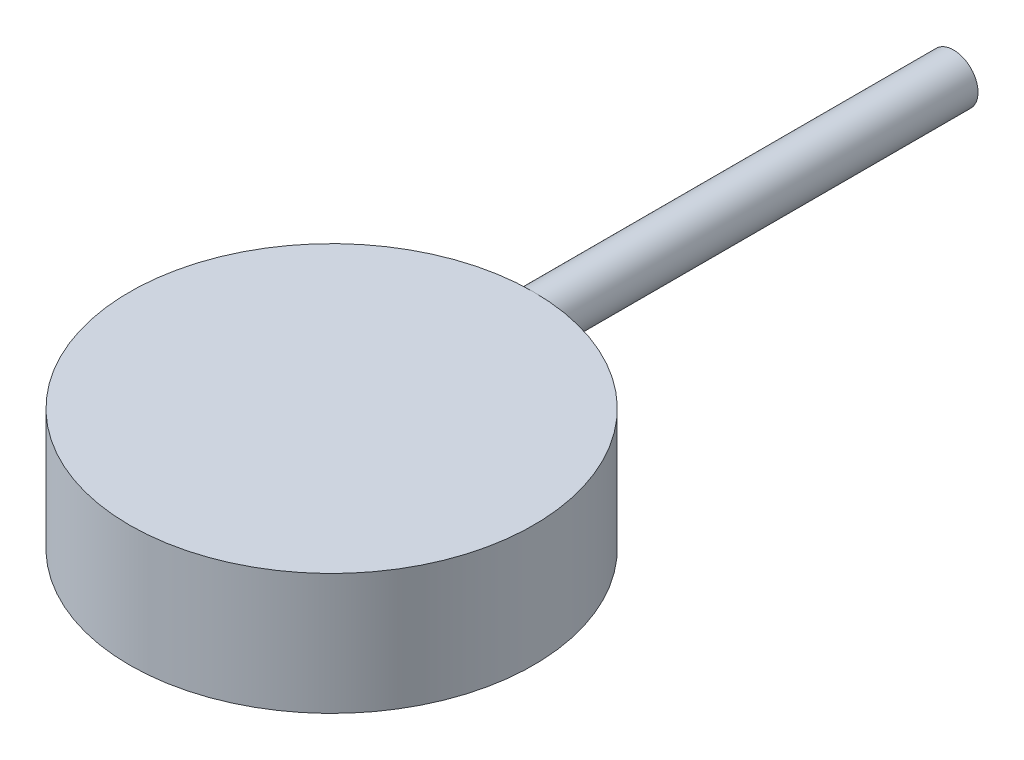
ISO-10303-21;
HEADER;
FILE_DESCRIPTION(('STEP AP214'),'2;1');
FILE_NAME('part.step','',(''),(''),'','','');
FILE_SCHEMA(('AUTOMOTIVE_DESIGN { 1 0 10303 214 1 1 1 1 }'));
ENDSEC;
DATA;
#1=APPLICATION_CONTEXT('core data for automotive mechanical design processes');
#2=APPLICATION_PROTOCOL_DEFINITION('international standard','automotive_design',2000,#1);
#3=PRODUCT_CONTEXT('',#1,'mechanical');
#4=PRODUCT('Part','Part','',(#3));
#5=PRODUCT_RELATED_PRODUCT_CATEGORY('part','',(#4));
#6=PRODUCT_DEFINITION_FORMATION('','',#4);
#7=PRODUCT_DEFINITION_CONTEXT('part definition',#1,'design');
#8=PRODUCT_DEFINITION('design','',#6,#7);
#9=PRODUCT_DEFINITION_SHAPE('','',#8);
#10=(LENGTH_UNIT() NAMED_UNIT(*) SI_UNIT(.MILLI.,.METRE.));
#11=(NAMED_UNIT(*) PLANE_ANGLE_UNIT() SI_UNIT($,.RADIAN.));
#12=(NAMED_UNIT(*) SI_UNIT($,.STERADIAN.) SOLID_ANGLE_UNIT());
#13=UNCERTAINTY_MEASURE_WITH_UNIT(LENGTH_MEASURE(1.E-05),#10,'distance_accuracy_value','');
#14=(GEOMETRIC_REPRESENTATION_CONTEXT(3) GLOBAL_UNCERTAINTY_ASSIGNED_CONTEXT((#13)) GLOBAL_UNIT_ASSIGNED_CONTEXT((#10,
#11,#12)) REPRESENTATION_CONTEXT('',''));
#15=CARTESIAN_POINT('',(0.,0.,0.));
#16=DIRECTION('',(0.,0.,1.));
#17=DIRECTION('',(1.,0.,0.));
#18=AXIS2_PLACEMENT_3D('',#15,#16,#17);
#19=CARTESIAN_POINT('',(0.,-19.67000003,0.));
#20=DIRECTION('',(0.,1.,0.));
#21=DIRECTION('',(0.,0.,1.));
#22=AXIS2_PLACEMENT_3D('',#19,#20,#21);
#23=CYLINDRICAL_SURFACE('',#22,41.25);
#24=CARTESIAN_POINT('',(-5.00000000000001,0.,-40.945848385398));
#25=CARTESIAN_POINT('',(-5.00000156734093,0.139920685005649,-40.9458478610933));
#26=CARTESIAN_POINT('',(-4.99412454109283,0.279818224188652,-40.9465670468577));
#27=CARTESIAN_POINT('',(-4.97066135474927,0.558657802768484,-40.9494221226675));
#28=CARTESIAN_POINT('',(-4.95307251442311,0.697599616093763,-40.9515583369974));
#29=CARTESIAN_POINT('',(-4.90629437802048,0.973592920854009,-40.9571889643499));
#30=CARTESIAN_POINT('',(-4.8770963362389,1.11064290636975,-40.960684401289));
#31=CARTESIAN_POINT('',(-4.80730369650415,1.38182494855259,-40.968934150293));
#32=CARTESIAN_POINT('',(-4.76670492390868,1.51595591693179,-40.9736889234567));
#33=CARTESIAN_POINT('',(-4.6744610876536,1.78016064082873,-40.9843148610967));
#34=CARTESIAN_POINT('',(-4.62282756619104,1.91023847421451,-40.9901848583569));
#35=CARTESIAN_POINT('',(-4.50884195814959,2.16561869954513,-41.0028795538187));
#36=CARTESIAN_POINT('',(-4.4464859238469,2.29091931182129,-41.0097046034705));
#37=CARTESIAN_POINT('',(-4.31155202035671,2.53575359750926,-41.0241102010539));
#38=CARTESIAN_POINT('',(-4.23897980596531,2.65529041245059,-41.0316903303643));
#39=CARTESIAN_POINT('',(-4.08407190488934,2.88788649445292,-41.0473984207842));
#40=CARTESIAN_POINT('',(-4.00173260472004,3.00094334106178,-41.0555265841643));
#41=CARTESIAN_POINT('',(-3.82751100040631,3.22022575632799,-41.0721358974309));
#42=CARTESIAN_POINT('',(-3.73558884076753,3.32641955680075,-41.0806184258526));
#43=CARTESIAN_POINT('',(-3.5431080050124,3.53073526353151,-41.0976668582032));
#44=CARTESIAN_POINT('',(-3.44254614759134,3.62885417019382,-41.1062327918051));
#45=CARTESIAN_POINT('',(-3.23355025836479,3.81626079067022,-41.1232007271131));
#46=CARTESIAN_POINT('',(-3.12511874529276,3.9055513086411,-41.1316027801874));
#47=CARTESIAN_POINT('',(-2.90106936651815,4.07474046822888,-41.1480122945196));
#48=CARTESIAN_POINT('',(-2.78544886460709,4.15463563313893,-41.1560196090738));
#49=CARTESIAN_POINT('',(-2.54753701201238,4.30463512627856,-41.1714318377068));
#50=CARTESIAN_POINT('',(-2.42522822139152,4.37471197722439,-41.1788350378973));
#51=CARTESIAN_POINT('',(-2.17505018067412,4.50433293925224,-41.1928071615184));
#52=CARTESIAN_POINT('',(-2.04717888459932,4.56387313326972,-41.1993757744314));
#53=CARTESIAN_POINT('',(-1.78686312344441,4.67193337686127,-41.2114858999645));
#54=CARTESIAN_POINT('',(-1.65442049565467,4.72045779577751,-41.2170278196554));
#55=CARTESIAN_POINT('',(-1.38585998132739,4.80617301722313,-41.226933115441));
#56=CARTESIAN_POINT('',(-1.24974076425026,4.84335965518341,-41.2312960584097));
#57=CARTESIAN_POINT('',(-0.838776795866352,4.93709815451735,-41.2423735925483));
#58=CARTESIAN_POINT('',(-0.559741254395313,4.97648414058048,-41.2471528439316));
#59=CARTESIAN_POINT('',(0.000864873110700002,5.00788650468529,-41.2509541475626));
#60=CARTESIAN_POINT('',(0.28243536464931,4.99990464123694,-41.2499764135358));
#61=CARTESIAN_POINT('',(0.838746560771973,4.93704427334209,-41.2424047713999));
#62=CARTESIAN_POINT('',(1.11351535082379,4.88241207344978,-41.2358403604455));
#63=CARTESIAN_POINT('',(1.64994474688822,4.72817002594305,-41.2178635484765));
#64=CARTESIAN_POINT('',(1.91160511626346,4.62855936668794,-41.206451059978));
#65=CARTESIAN_POINT('',(2.41516834843399,4.38692907653986,-41.180010401368));
#66=CARTESIAN_POINT('',(2.657019369968,4.24480243097847,-41.1649731262732));
#67=CARTESIAN_POINT('',(3.11352948348488,3.92225125628798,-41.1329658878248));
#68=CARTESIAN_POINT('',(3.32818740197195,3.74182507527259,-41.115995841124));
#69=CARTESIAN_POINT('',(3.72566563151781,3.34641592996415,-41.0818944003364));
#70=CARTESIAN_POINT('',(3.90827244527605,3.13121831240132,-41.064762670257));
#71=CARTESIAN_POINT('',(4.23480642638722,2.67311338813727,-41.0323765403019));
#72=CARTESIAN_POINT('',(4.37873348516792,2.4302060036588,-41.0171221456959));
#73=CARTESIAN_POINT('',(4.62383247463556,1.92339091697703,-40.9902178075129));
#74=CARTESIAN_POINT('',(4.72498795160105,1.65947517941507,-40.9785692515203));
#75=CARTESIAN_POINT('',(4.88148638121458,1.11823086941357,-40.9602228498207));
#76=CARTESIAN_POINT('',(4.93683140562784,0.840902904138817,-40.9535247802308));
#77=CARTESIAN_POINT('',(4.99985649482454,0.282590191349801,-40.9458783518043));
#78=CARTESIAN_POINT('',(5.00783672378771,0.00163980467735969,-40.9448937857589));
#79=CARTESIAN_POINT('',(4.97669706610532,-0.557593938206384,-40.9486901214031));
#80=CARTESIAN_POINT('',(4.93757812202187,-0.835877347677662,-40.9534709077148));
#81=CARTESIAN_POINT('',(4.8136030508153,-1.38098225061523,-40.9682262553432));
#82=CARTESIAN_POINT('',(4.72889170276819,-1.64783715514397,-40.9781843726155));
#83=CARTESIAN_POINT('',(4.51628522450487,-2.16355413726454,-41.0021590255336));
#84=CARTESIAN_POINT('',(4.3883886630662,-2.41241561819553,-41.0161756956836));
#85=CARTESIAN_POINT('',(4.09230222805202,-2.88644123388232,-41.0467750295535));
#86=CARTESIAN_POINT('',(3.92391517247059,-3.11148138978618,-41.0633701052238));
#87=CARTESIAN_POINT('',(3.55190601557194,-3.53021248788316,-41.0972171468666));
#88=CARTESIAN_POINT('',(3.3482826269966,-3.72390228428054,-41.1144691368197));
#89=CARTESIAN_POINT('',(2.91027493324008,-4.07548612222299,-41.1477971687141));
#90=CARTESIAN_POINT('',(2.67573192203079,-4.23318316117016,-41.1638664272836));
#91=CARTESIAN_POINT('',(2.18330256936766,-4.50694176999013,-41.1929170446405));
#92=CARTESIAN_POINT('',(1.92541667436811,-4.62300413595403,-41.2058984624685));
#93=CARTESIAN_POINT('',(1.39433472814769,-4.80987723168442,-41.2272820599309));
#94=CARTESIAN_POINT('',(1.12117941444978,-4.88080265140335,-41.2356958375645));
#95=CARTESIAN_POINT('',(0.566574482719354,-4.97574272683446,-41.2470386394509));
#96=CARTESIAN_POINT('',(0.285125215780894,-4.99975936537033,-41.2499678955331));
#97=CARTESIAN_POINT('',(-0.135887008067502,-5.00011733875141,-41.2500156833601));
#98=CARTESIAN_POINT('',(-0.275656425973422,-4.99435511948953,-41.2493149305635));
#99=CARTESIAN_POINT('',(-0.55419438247298,-4.97115277836058,-41.2465113134703));
#100=CARTESIAN_POINT('',(-0.692963274227604,-4.95371700375969,-41.244408971131));
#101=CARTESIAN_POINT('',(-0.968566970799517,-4.90728280637516,-41.2388579214075));
#102=CARTESIAN_POINT('',(-1.10540105361511,-4.87828017932407,-41.2354087244843));
#103=CARTESIAN_POINT('',(-1.37607793988196,-4.8089414042837,-41.2272632065818));
#104=CARTESIAN_POINT('',(-1.50992181353546,-4.76860938360107,-41.2225673397994));
#105=CARTESIAN_POINT('',(-1.77373073454619,-4.67689885807865,-41.2120590373721));
#106=CARTESIAN_POINT('',(-1.90369559476958,-4.6255198212795,-41.2062465479585));
#107=CARTESIAN_POINT('',(-2.15878574956992,-4.51210817123477,-41.1936699891847));
#108=CARTESIAN_POINT('',(-2.28391278304643,-4.45007943034623,-41.1869062658655));
#109=CARTESIAN_POINT('',(-2.52855315093761,-4.31577316007244,-41.1726115306329));
#110=CARTESIAN_POINT('',(-2.64806442210636,-4.24349190247908,-41.1650802398844));
#111=CARTESIAN_POINT('',(-2.88055681638465,-4.08923557438372,-41.1494649341114));
#112=CARTESIAN_POINT('',(-2.99354027142661,-4.00726399783131,-41.1413811187466));
#113=CARTESIAN_POINT('',(-3.21296117217867,-3.83361227062702,-41.124829079463));
#114=CARTESIAN_POINT('',(-3.31935104654429,-3.74187220951177,-41.1163586897729));
#115=CARTESIAN_POINT('',(-3.52399601286962,-3.54980805136521,-41.0993247351352));
#116=CARTESIAN_POINT('',(-3.62225404315903,-3.44948708180748,-41.0907612051191));
#117=CARTESIAN_POINT('',(-3.81004978885774,-3.24086864532628,-41.0737740869415));
#118=CARTESIAN_POINT('',(-3.89958218944311,-3.132566386615,-41.0653505866314));
#119=CARTESIAN_POINT('',(-4.06919837782897,-2.90883546007928,-41.0488901775082));
#120=CARTESIAN_POINT('',(-4.14928564255197,-2.79340943862429,-41.0408531270854));
#121=CARTESIAN_POINT('',(-4.2997847517671,-2.55572224653382,-41.0253592235934));
#122=CARTESIAN_POINT('',(-4.37015643764735,-2.43343548157297,-41.0179048308737));
#123=CARTESIAN_POINT('',(-4.50031006017598,-2.18336255527378,-41.0038290212709));
#124=CARTESIAN_POINT('',(-4.560095880887,-2.05557843245191,-40.997207299132));
#125=CARTESIAN_POINT('',(-4.66863091021767,-1.79547360978914,-40.9849895597647));
#126=CARTESIAN_POINT('',(-4.71738880838338,-1.6631565770304,-40.9793927356257));
#127=CARTESIAN_POINT('',(-4.8035568470319,-1.39488100031471,-40.969381470158));
#128=CARTESIAN_POINT('',(-4.84096968411839,-1.25892333007416,-40.9649667478851));
#129=CARTESIAN_POINT('',(-4.91485435855566,-0.937925972649815,-40.956178444234));
#130=CARTESIAN_POINT('',(-4.94675145184228,-0.75180036567196,-40.9523211049877));
#131=CARTESIAN_POINT('',(-4.98932314271468,-0.377102487284451,-40.9471564376785));
#132=CARTESIAN_POINT('',(-4.9999978881525,-0.188530232929331,-40.9458490918503));
#133=CARTESIAN_POINT('',(-5.00000000000001,0.,-40.945848385398));
#134=B_SPLINE_CURVE_WITH_KNOTS('',3,(#24,#25,#26,#27,#28,#29,#30,#31,#32,#33,#34,#35,#36,#37,
#38,#39,#40,#41,#42,#43,#44,#45,#46,#47,#48,#49,#50,#51,#52,#53,#54,#55,#56,#57,#58,#59,#60,#61,
#62,#63,#64,#65,#66,#67,#68,#69,#70,#71,#72,#73,#74,#75,#76,#77,#78,#79,#80,#81,#82,#83,#84,#85,
#86,#87,#88,#89,#90,#91,#92,#93,#94,#95,#96,#97,#98,#99,#100,#101,#102,#103,#104,#105,#106,#107,
#108,#109,#110,#111,#112,#113,#114,#115,#116,#117,#118,#119,#120,#121,#122,#123,#124,#125,#126,
#127,#128,#129,#130,#131,#132,#133),.UNSPECIFIED.,.T.,.F.,(4,2,2,2,2,2,2,2,2,2,2,2,2,2,2,2,2,2,
2,2,2,2,2,2,2,2,2,2,2,2,2,2,2,2,2,2,2,2,2,2,2,2,2,2,2,2,2,2,2,2,2,2,2,2,4),(0.,
0.419597067906306,0.839290192976321,1.25930009160689,1.67946398761037,2.09919053029553,
2.51907193650323,2.938721839791,3.35852748615517,3.78015460243768,4.20193764092809,
4.62358627536917,5.04539045119337,5.46835245577005,5.89147137016386,6.31442216256021,
6.73752812567273,7.57865654511359,8.41975373823812,9.25643736980387,10.0931361000107,
10.9319588175638,11.7708177214931,12.6150682205385,13.4593210893298,14.3038984373825,
15.1484375875677,15.9876188894846,16.8267833977443,17.6632987201434,18.4998417686308,
19.3405442240898,20.1812773986823,21.0265074172732,21.871721273471,22.7147788317337,
23.5578007533706,23.9770624128028,24.3961680247474,24.8154261103497,25.2345316575562,
25.6536573909444,26.0726310468248,26.4917574500503,26.9107331910013,27.3324452711678,
27.754004300071,28.1758185185307,28.5974769717683,29.0208292326339,29.4440258378677,
29.866887810896,30.2896491950807,30.8550215277908,31.4203899216466),.UNSPECIFIED.);
#135=CARTESIAN_POINT('',(-5.00000000000001,0.,-40.945848385398));
#136=VERTEX_POINT('',#135);
#137=EDGE_CURVE('E10',#136,#136,#134,.T.);
#138=ORIENTED_EDGE('',*,*,#137,.F.);
#139=EDGE_LOOP('',(#138));
#140=FACE_BOUND('',#139,.T.);
#141=CARTESIAN_POINT('',(0.,-19.67000003,0.));
#142=DIRECTION('',(0.,1.,0.));
#143=DIRECTION('',(0.,0.,1.));
#144=AXIS2_PLACEMENT_3D('',#141,#142,#143);
#145=CIRCLE('',#144,41.25);
#146=CARTESIAN_POINT('',(0.,-19.67000003,41.25));
#147=VERTEX_POINT('',#146);
#148=EDGE_CURVE('E40',#147,#147,#145,.T.);
#149=ORIENTED_EDGE('',*,*,#148,.T.);
#150=EDGE_LOOP('',(#149));
#151=FACE_BOUND('',#150,.T.);
#152=CARTESIAN_POINT('',(0.,5.08,0.));
#153=DIRECTION('',(0.,1.,0.));
#154=DIRECTION('',(0.,0.,1.));
#155=AXIS2_PLACEMENT_3D('',#152,#153,#154);
#156=CIRCLE('',#155,41.25);
#157=CARTESIAN_POINT('',(0.,5.08,41.25));
#158=VERTEX_POINT('',#157);
#159=EDGE_CURVE('E44',#158,#158,#156,.T.);
#160=ORIENTED_EDGE('',*,*,#159,.F.);
#161=EDGE_LOOP('',(#160));
#162=FACE_BOUND('',#161,.T.);
#163=ADVANCED_FACE('F30',(#140,#151,#162),#23,.T.);
#164=CARTESIAN_POINT('',(0.,-19.67000003,0.));
#165=DIRECTION('',(0.,1.,0.));
#166=DIRECTION('',(0.,0.,1.));
#167=AXIS2_PLACEMENT_3D('',#164,#165,#166);
#168=PLANE('',#167);
#169=ORIENTED_EDGE('',*,*,#148,.F.);
#170=EDGE_LOOP('',(#169));
#171=FACE_BOUND('',#170,.T.);
#172=ADVANCED_FACE('F64',(#171),#168,.F.);
#173=CARTESIAN_POINT('',(0.,5.08,0.));
#174=DIRECTION('',(0.,1.,0.));
#175=DIRECTION('',(0.,0.,1.));
#176=AXIS2_PLACEMENT_3D('',#173,#174,#175);
#177=PLANE('',#176);
#178=ORIENTED_EDGE('',*,*,#159,.T.);
#179=EDGE_LOOP('',(#178));
#180=FACE_BOUND('',#179,.T.);
#181=ADVANCED_FACE('F58',(#180),#177,.T.);
#182=CARTESIAN_POINT('',(0.,0.,-127.));
#183=DIRECTION('',(0.,0.,-1.));
#184=DIRECTION('',(-1.,0.,0.));
#185=AXIS2_PLACEMENT_3D('',#182,#183,#184);
#186=CYLINDRICAL_SURFACE('',#185,5.00000000000001);
#187=ORIENTED_EDGE('',*,*,#137,.T.);
#188=EDGE_LOOP('',(#187));
#189=FACE_BOUND('',#188,.T.);
#190=CARTESIAN_POINT('',(0.,0.,-127.));
#191=DIRECTION('',(0.,0.,-1.));
#192=DIRECTION('',(-1.,0.,0.));
#193=AXIS2_PLACEMENT_3D('',#190,#191,#192);
#194=CIRCLE('',#193,5.00000000000002);
#195=CARTESIAN_POINT('',(-5.00000000000002,0.,-127.));
#196=VERTEX_POINT('',#195);
#197=EDGE_CURVE('E48',#196,#196,#194,.T.);
#198=ORIENTED_EDGE('',*,*,#197,.F.);
#199=EDGE_LOOP('',(#198));
#200=FACE_BOUND('',#199,.T.);
#201=ADVANCED_FACE('F56',(#189,#200),#186,.T.);
#202=CARTESIAN_POINT('',(-5.00000000000001,0.,-127.));
#203=DIRECTION('',(0.,0.,-1.));
#204=DIRECTION('',(-1.,0.,0.));
#205=AXIS2_PLACEMENT_3D('',#202,#203,#204);
#206=PLANE('',#205);
#207=ORIENTED_EDGE('',*,*,#197,.T.);
#208=EDGE_LOOP('',(#207));
#209=FACE_BOUND('',#208,.T.);
#210=ADVANCED_FACE('F54',(#209),#206,.T.);
#211=CLOSED_SHELL('',(#163,#172,#181,#201,#210));
#212=MANIFOLD_SOLID_BREP('B2',#211);
#213=ADVANCED_BREP_SHAPE_REPRESENTATION('',(#18,#212),#14);
#214=SHAPE_DEFINITION_REPRESENTATION(#9,#213);
ENDSEC;
END-ISO-10303-21;
